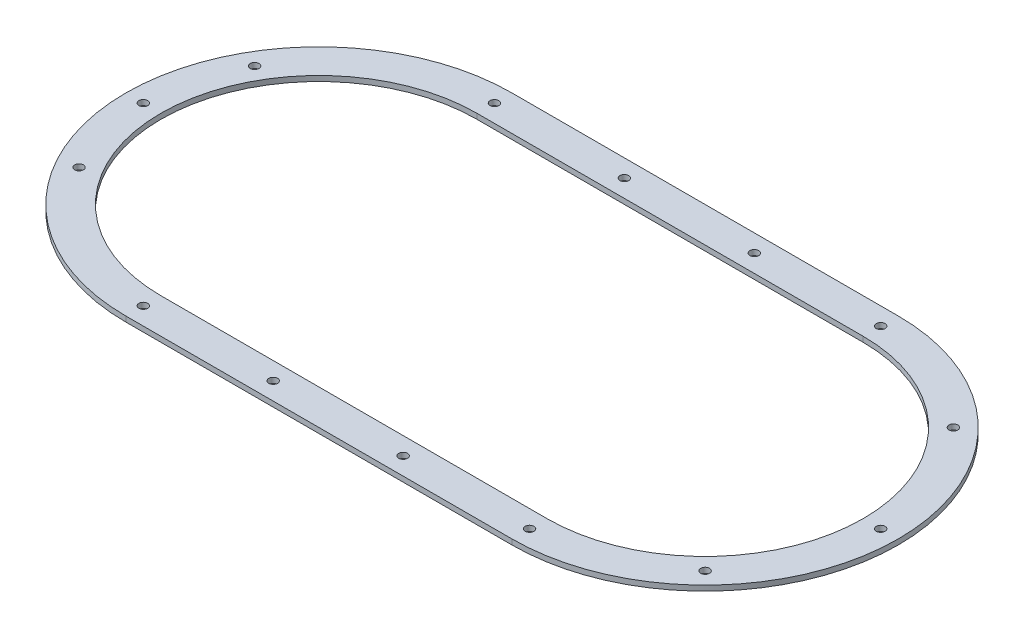
ISO-10303-21;
HEADER;
FILE_DESCRIPTION(('STEP AP214'),'2;1');
FILE_NAME('part.step','',(''),(''),'','','');
FILE_SCHEMA(('AUTOMOTIVE_DESIGN { 1 0 10303 214 1 1 1 1 }'));
ENDSEC;
DATA;
#1=APPLICATION_CONTEXT('core data for automotive mechanical design processes');
#2=APPLICATION_PROTOCOL_DEFINITION('international standard','automotive_design',2000,#1);
#3=PRODUCT_CONTEXT('',#1,'mechanical');
#4=PRODUCT('Part','Part','',(#3));
#5=PRODUCT_RELATED_PRODUCT_CATEGORY('part','',(#4));
#6=PRODUCT_DEFINITION_FORMATION('','',#4);
#7=PRODUCT_DEFINITION_CONTEXT('part definition',#1,'design');
#8=PRODUCT_DEFINITION('design','',#6,#7);
#9=PRODUCT_DEFINITION_SHAPE('','',#8);
#10=(LENGTH_UNIT() NAMED_UNIT(*) SI_UNIT(.MILLI.,.METRE.));
#11=(NAMED_UNIT(*) PLANE_ANGLE_UNIT() SI_UNIT($,.RADIAN.));
#12=(NAMED_UNIT(*) SI_UNIT($,.STERADIAN.) SOLID_ANGLE_UNIT());
#13=UNCERTAINTY_MEASURE_WITH_UNIT(LENGTH_MEASURE(1.E-05),#10,'distance_accuracy_value','');
#14=(GEOMETRIC_REPRESENTATION_CONTEXT(3) GLOBAL_UNCERTAINTY_ASSIGNED_CONTEXT((#13)) GLOBAL_UNIT_ASSIGNED_CONTEXT((#10,
#11,#12)) REPRESENTATION_CONTEXT('',''));
#15=CARTESIAN_POINT('',(0.,0.,0.));
#16=DIRECTION('',(0.,0.,1.));
#17=DIRECTION('',(1.,0.,0.));
#18=AXIS2_PLACEMENT_3D('',#15,#16,#17);
#19=CARTESIAN_POINT('',(288.544468479895,3.,-125.010465990964));
#20=DIRECTION('',(0.,-1.,0.));
#21=DIRECTION('',(0.,0.,-1.));
#22=AXIS2_PLACEMENT_3D('',#19,#20,#21);
#23=CYLINDRICAL_SURFACE('',#22,90.);
#24=CARTESIAN_POINT('',(288.544468479895,0.,-125.010465990964));
#25=DIRECTION('',(0.,1.,0.));
#26=DIRECTION('',(0.,0.,1.));
#27=AXIS2_PLACEMENT_3D('',#24,#25,#26);
#28=CIRCLE('',#27,90.);
#29=CARTESIAN_POINT('',(288.544468479896,0.,-35.0104659909643));
#30=VERTEX_POINT('',#29);
#31=CARTESIAN_POINT('',(288.544468479896,0.,-215.010465990964));
#32=VERTEX_POINT('',#31);
#33=EDGE_CURVE('E214',#30,#32,#28,.T.);
#34=ORIENTED_EDGE('',*,*,#33,.F.);
#35=DIRECTION('',(0.,-1.,0.));
#36=VECTOR('',#35,1.);
#37=CARTESIAN_POINT('',(288.544468479896,3.,-35.0104659909643));
#38=LINE('',#37,#36);
#39=CARTESIAN_POINT('',(288.544468479896,3.,-35.0104659909643));
#40=VERTEX_POINT('',#39);
#41=EDGE_CURVE('E11',#40,#30,#38,.T.);
#42=ORIENTED_EDGE('',*,*,#41,.F.);
#43=CARTESIAN_POINT('',(288.544468479895,3.,-125.010465990964));
#44=DIRECTION('',(0.,1.,0.));
#45=DIRECTION('',(0.,0.,1.));
#46=AXIS2_PLACEMENT_3D('',#43,#44,#45);
#47=CIRCLE('',#46,90.);
#48=CARTESIAN_POINT('',(288.544468479896,3.,-215.010465990964));
#49=VERTEX_POINT('',#48);
#50=EDGE_CURVE('E132',#40,#49,#47,.T.);
#51=ORIENTED_EDGE('',*,*,#50,.T.);
#52=DIRECTION('',(0.,-1.,0.));
#53=VECTOR('',#52,1.);
#54=CARTESIAN_POINT('',(288.544468479896,3.,-215.010465990964));
#55=LINE('',#54,#53);
#56=EDGE_CURVE('E95',#49,#32,#55,.T.);
#57=ORIENTED_EDGE('',*,*,#56,.T.);
#58=EDGE_LOOP('',(#34,#42,#51,#57));
#59=FACE_BOUND('',#58,.T.);
#60=ADVANCED_FACE('F41',(#59),#23,.F.);
#61=CARTESIAN_POINT('',(0.,3.,-35.0104659909643));
#62=DIRECTION('',(0.,0.,-1.));
#63=DIRECTION('',(-1.,0.,0.));
#64=AXIS2_PLACEMENT_3D('',#61,#62,#63);
#65=PLANE('',#64);
#66=DIRECTION('',(1.,0.,0.));
#67=VECTOR('',#66,1.);
#68=CARTESIAN_POINT('',(0.,0.,-35.0104659909643));
#69=LINE('',#68,#67);
#70=CARTESIAN_POINT('',(68.5444684798952,0.,-35.0104659909643));
#71=VERTEX_POINT('',#70);
#72=EDGE_CURVE('E123',#71,#30,#69,.T.);
#73=ORIENTED_EDGE('',*,*,#72,.F.);
#74=DIRECTION('',(0.,-1.,0.));
#75=VECTOR('',#74,1.);
#76=CARTESIAN_POINT('',(68.5444684798952,3.,-35.0104659909643));
#77=LINE('',#76,#75);
#78=CARTESIAN_POINT('',(68.5444684798952,3.,-35.0104659909643));
#79=VERTEX_POINT('',#78);
#80=EDGE_CURVE('E52',#79,#71,#77,.T.);
#81=ORIENTED_EDGE('',*,*,#80,.F.);
#82=DIRECTION('',(1.,0.,0.));
#83=VECTOR('',#82,1.);
#84=CARTESIAN_POINT('',(0.,3.,-35.0104659909643));
#85=LINE('',#84,#83);
#86=EDGE_CURVE('E121',#79,#40,#85,.T.);
#87=ORIENTED_EDGE('',*,*,#86,.T.);
#88=ORIENTED_EDGE('',*,*,#41,.T.);
#89=EDGE_LOOP('',(#73,#81,#87,#88));
#90=FACE_BOUND('',#89,.T.);
#91=ADVANCED_FACE('F120',(#90),#65,.T.);
#92=CARTESIAN_POINT('',(68.5444684798952,3.,-125.010465990964));
#93=DIRECTION('',(0.,-1.,0.));
#94=DIRECTION('',(0.,0.,-1.));
#95=AXIS2_PLACEMENT_3D('',#92,#93,#94);
#96=CYLINDRICAL_SURFACE('',#95,90.);
#97=CARTESIAN_POINT('',(68.5444684798952,0.,-125.010465990964));
#98=DIRECTION('',(0.,1.,0.));
#99=DIRECTION('',(0.,0.,1.));
#100=AXIS2_PLACEMENT_3D('',#97,#98,#99);
#101=CIRCLE('',#100,90.);
#102=CARTESIAN_POINT('',(68.5444684798952,0.,-215.010465990964));
#103=VERTEX_POINT('',#102);
#104=EDGE_CURVE('E220',#103,#71,#101,.T.);
#105=ORIENTED_EDGE('',*,*,#104,.F.);
#106=DIRECTION('',(0.,-1.,0.));
#107=VECTOR('',#106,1.);
#108=CARTESIAN_POINT('',(68.5444684798952,3.,-215.010465990964));
#109=LINE('',#108,#107);
#110=CARTESIAN_POINT('',(68.5444684798952,3.,-215.010465990964));
#111=VERTEX_POINT('',#110);
#112=EDGE_CURVE('E88',#111,#103,#109,.T.);
#113=ORIENTED_EDGE('',*,*,#112,.F.);
#114=CARTESIAN_POINT('',(68.5444684798952,3.,-125.010465990964));
#115=DIRECTION('',(0.,1.,0.));
#116=DIRECTION('',(0.,0.,1.));
#117=AXIS2_PLACEMENT_3D('',#114,#115,#116);
#118=CIRCLE('',#117,90.);
#119=EDGE_CURVE('E131',#111,#79,#118,.T.);
#120=ORIENTED_EDGE('',*,*,#119,.T.);
#121=ORIENTED_EDGE('',*,*,#80,.T.);
#122=EDGE_LOOP('',(#105,#113,#120,#121));
#123=FACE_BOUND('',#122,.T.);
#124=ADVANCED_FACE('F135',(#123),#96,.F.);
#125=CARTESIAN_POINT('',(0.,3.,-15.0104659909643));
#126=DIRECTION('',(0.,0.,-1.));
#127=DIRECTION('',(-1.,0.,0.));
#128=AXIS2_PLACEMENT_3D('',#125,#126,#127);
#129=PLANE('',#128);
#130=DIRECTION('',(1.,0.,0.));
#131=VECTOR('',#130,1.);
#132=CARTESIAN_POINT('',(0.,0.,-15.0104659909643));
#133=LINE('',#132,#131);
#134=CARTESIAN_POINT('',(68.5444684798952,0.,-15.0104659909643));
#135=VERTEX_POINT('',#134);
#136=CARTESIAN_POINT('',(288.544468479897,0.,-15.0104659909643));
#137=VERTEX_POINT('',#136);
#138=EDGE_CURVE('E199',#135,#137,#133,.T.);
#139=ORIENTED_EDGE('',*,*,#138,.T.);
#140=DIRECTION('',(0.,-1.,0.));
#141=VECTOR('',#140,1.);
#142=CARTESIAN_POINT('',(288.544468479897,3.,-15.0104659909643));
#143=LINE('',#142,#141);
#144=CARTESIAN_POINT('',(288.544468479897,3.,-15.0104659909643));
#145=VERTEX_POINT('',#144);
#146=EDGE_CURVE('E45',#145,#137,#143,.T.);
#147=ORIENTED_EDGE('',*,*,#146,.F.);
#148=DIRECTION('',(1.,0.,0.));
#149=VECTOR('',#148,1.);
#150=CARTESIAN_POINT('',(0.,3.,-15.0104659909643));
#151=LINE('',#150,#149);
#152=CARTESIAN_POINT('',(68.5444684798952,3.,-15.0104659909643));
#153=VERTEX_POINT('',#152);
#154=EDGE_CURVE('E266',#153,#145,#151,.T.);
#155=ORIENTED_EDGE('',*,*,#154,.F.);
#156=DIRECTION('',(0.,-1.,0.));
#157=VECTOR('',#156,1.);
#158=CARTESIAN_POINT('',(68.5444684798952,3.,-15.0104659909643));
#159=LINE('',#158,#157);
#160=EDGE_CURVE('E139',#153,#135,#159,.T.);
#161=ORIENTED_EDGE('',*,*,#160,.T.);
#162=EDGE_LOOP('',(#139,#147,#155,#161));
#163=FACE_BOUND('',#162,.T.);
#164=ADVANCED_FACE('F247',(#163),#129,.F.);
#165=CARTESIAN_POINT('',(288.544468479895,3.,-125.010465990964));
#166=DIRECTION('',(0.,-1.,0.));
#167=DIRECTION('',(0.,0.,-1.));
#168=AXIS2_PLACEMENT_3D('',#165,#166,#167);
#169=CYLINDRICAL_SURFACE('',#168,110.);
#170=CARTESIAN_POINT('',(288.544468479895,0.,-125.010465990964));
#171=DIRECTION('',(0.,1.,0.));
#172=DIRECTION('',(0.,0.,1.));
#173=AXIS2_PLACEMENT_3D('',#170,#171,#172);
#174=CIRCLE('',#173,110.);
#175=CARTESIAN_POINT('',(288.544468479896,0.,-235.010465990964));
#176=VERTEX_POINT('',#175);
#177=EDGE_CURVE('E203',#137,#176,#174,.T.);
#178=ORIENTED_EDGE('',*,*,#177,.T.);
#179=DIRECTION('',(0.,-1.,0.));
#180=VECTOR('',#179,1.);
#181=CARTESIAN_POINT('',(288.544468479896,3.,-235.010465990964));
#182=LINE('',#181,#180);
#183=CARTESIAN_POINT('',(288.544468479896,3.,-235.010465990964));
#184=VERTEX_POINT('',#183);
#185=EDGE_CURVE('E236',#184,#176,#182,.T.);
#186=ORIENTED_EDGE('',*,*,#185,.F.);
#187=CARTESIAN_POINT('',(288.544468479895,3.,-125.010465990964));
#188=DIRECTION('',(0.,1.,0.));
#189=DIRECTION('',(0.,0.,1.));
#190=AXIS2_PLACEMENT_3D('',#187,#188,#189);
#191=CIRCLE('',#190,110.);
#192=EDGE_CURVE('E103',#145,#184,#191,.T.);
#193=ORIENTED_EDGE('',*,*,#192,.F.);
#194=ORIENTED_EDGE('',*,*,#146,.T.);
#195=EDGE_LOOP('',(#178,#186,#193,#194));
#196=FACE_BOUND('',#195,.T.);
#197=ADVANCED_FACE('F243',(#196),#169,.T.);
#198=CARTESIAN_POINT('',(0.,3.,-235.010465990964));
#199=DIRECTION('',(0.,0.,-1.));
#200=DIRECTION('',(-1.,0.,0.));
#201=AXIS2_PLACEMENT_3D('',#198,#199,#200);
#202=PLANE('',#201);
#203=DIRECTION('',(1.,0.,0.));
#204=VECTOR('',#203,1.);
#205=CARTESIAN_POINT('',(0.,0.,-235.010465990964));
#206=LINE('',#205,#204);
#207=CARTESIAN_POINT('',(68.5444684798952,0.,-235.010465990964));
#208=VERTEX_POINT('',#207);
#209=EDGE_CURVE('E207',#208,#176,#206,.T.);
#210=ORIENTED_EDGE('',*,*,#209,.F.);
#211=DIRECTION('',(0.,-1.,0.));
#212=VECTOR('',#211,1.);
#213=CARTESIAN_POINT('',(68.5444684798952,3.,-235.010465990964));
#214=LINE('',#213,#212);
#215=CARTESIAN_POINT('',(68.5444684798952,3.,-235.010465990964));
#216=VERTEX_POINT('',#215);
#217=EDGE_CURVE('E234',#216,#208,#214,.T.);
#218=ORIENTED_EDGE('',*,*,#217,.F.);
#219=DIRECTION('',(1.,0.,0.));
#220=VECTOR('',#219,1.);
#221=CARTESIAN_POINT('',(0.,3.,-235.010465990964));
#222=LINE('',#221,#220);
#223=EDGE_CURVE('E256',#216,#184,#222,.T.);
#224=ORIENTED_EDGE('',*,*,#223,.T.);
#225=ORIENTED_EDGE('',*,*,#185,.T.);
#226=EDGE_LOOP('',(#210,#218,#224,#225));
#227=FACE_BOUND('',#226,.T.);
#228=ADVANCED_FACE('F253',(#227),#202,.T.);
#229=CARTESIAN_POINT('',(68.5444684798952,3.,-125.010465990964));
#230=DIRECTION('',(0.,-1.,0.));
#231=DIRECTION('',(0.,0.,-1.));
#232=AXIS2_PLACEMENT_3D('',#229,#230,#231);
#233=CYLINDRICAL_SURFACE('',#232,110.);
#234=CARTESIAN_POINT('',(68.5444684798952,0.,-125.010465990964));
#235=DIRECTION('',(0.,1.,0.));
#236=DIRECTION('',(0.,0.,1.));
#237=AXIS2_PLACEMENT_3D('',#234,#235,#236);
#238=CIRCLE('',#237,110.);
#239=EDGE_CURVE('E211',#208,#135,#238,.T.);
#240=ORIENTED_EDGE('',*,*,#239,.T.);
#241=ORIENTED_EDGE('',*,*,#160,.F.);
#242=CARTESIAN_POINT('',(68.5444684798952,3.,-125.010465990964));
#243=DIRECTION('',(0.,1.,0.));
#244=DIRECTION('',(0.,0.,1.));
#245=AXIS2_PLACEMENT_3D('',#242,#243,#244);
#246=CIRCLE('',#245,110.);
#247=EDGE_CURVE('E258',#216,#153,#246,.T.);
#248=ORIENTED_EDGE('',*,*,#247,.F.);
#249=ORIENTED_EDGE('',*,*,#217,.T.);
#250=EDGE_LOOP('',(#240,#241,#248,#249));
#251=FACE_BOUND('',#250,.T.);
#252=ADVANCED_FACE('F259',(#251),#233,.T.);
#253=CARTESIAN_POINT('',(68.5444684798952,3.,-225.010465990964));
#254=DIRECTION('',(0.,-1.,0.));
#255=DIRECTION('',(0.,0.,-1.));
#256=AXIS2_PLACEMENT_3D('',#253,#254,#255);
#257=CYLINDRICAL_SURFACE('',#256,2.5);
#258=CARTESIAN_POINT('',(68.5444684798952,3.,-225.010465990964));
#259=DIRECTION('',(0.,1.,0.));
#260=DIRECTION('',(0.,0.,1.));
#261=AXIS2_PLACEMENT_3D('',#258,#259,#260);
#262=CIRCLE('',#261,2.5);
#263=CARTESIAN_POINT('',(68.5444684798952,3.,-222.510465990964));
#264=VERTEX_POINT('',#263);
#265=EDGE_CURVE('E591',#264,#264,#262,.T.);
#266=ORIENTED_EDGE('',*,*,#265,.T.);
#267=EDGE_LOOP('',(#266));
#268=FACE_BOUND('',#267,.T.);
#269=CARTESIAN_POINT('',(68.5444684798952,0.,-225.010465990964));
#270=DIRECTION('',(0.,1.,0.));
#271=DIRECTION('',(0.,0.,1.));
#272=AXIS2_PLACEMENT_3D('',#269,#270,#271);
#273=CIRCLE('',#272,2.5);
#274=CARTESIAN_POINT('',(68.5444684798952,0.,-222.510465990964));
#275=VERTEX_POINT('',#274);
#276=EDGE_CURVE('E195',#275,#275,#273,.T.);
#277=ORIENTED_EDGE('',*,*,#276,.F.);
#278=EDGE_LOOP('',(#277));
#279=FACE_BOUND('',#278,.T.);
#280=ADVANCED_FACE('F292',(#268,#279),#257,.F.);
#281=CARTESIAN_POINT('',(142.544468479895,3.,-225.010465990964));
#282=DIRECTION('',(0.,-1.,0.));
#283=DIRECTION('',(0.,0.,-1.));
#284=AXIS2_PLACEMENT_3D('',#281,#282,#283);
#285=CYLINDRICAL_SURFACE('',#284,2.5);
#286=CARTESIAN_POINT('',(142.544468479895,3.,-225.010465990964));
#287=DIRECTION('',(0.,1.,0.));
#288=DIRECTION('',(0.,0.,1.));
#289=AXIS2_PLACEMENT_3D('',#286,#287,#288);
#290=CIRCLE('',#289,2.5);
#291=CARTESIAN_POINT('',(142.544468479895,3.,-222.510465990964));
#292=VERTEX_POINT('',#291);
#293=EDGE_CURVE('E587',#292,#292,#290,.T.);
#294=ORIENTED_EDGE('',*,*,#293,.T.);
#295=EDGE_LOOP('',(#294));
#296=FACE_BOUND('',#295,.T.);
#297=CARTESIAN_POINT('',(142.544468479895,0.,-225.010465990964));
#298=DIRECTION('',(0.,1.,0.));
#299=DIRECTION('',(0.,0.,1.));
#300=AXIS2_PLACEMENT_3D('',#297,#298,#299);
#301=CIRCLE('',#300,2.5);
#302=CARTESIAN_POINT('',(142.544468479895,0.,-222.510465990964));
#303=VERTEX_POINT('',#302);
#304=EDGE_CURVE('E191',#303,#303,#301,.T.);
#305=ORIENTED_EDGE('',*,*,#304,.F.);
#306=EDGE_LOOP('',(#305));
#307=FACE_BOUND('',#306,.T.);
#308=ADVANCED_FACE('F301',(#296,#307),#285,.F.);
#309=CARTESIAN_POINT('',(-18.0580718985487,3.,-175.010465990964));
#310=DIRECTION('',(0.,-1.,0.));
#311=DIRECTION('',(0.,0.,-1.));
#312=AXIS2_PLACEMENT_3D('',#309,#310,#311);
#313=CYLINDRICAL_SURFACE('',#312,2.5);
#314=CARTESIAN_POINT('',(-18.0580718985487,3.,-175.010465990964));
#315=DIRECTION('',(0.,1.,0.));
#316=DIRECTION('',(0.,0.,1.));
#317=AXIS2_PLACEMENT_3D('',#314,#315,#316);
#318=CIRCLE('',#317,2.5);
#319=CARTESIAN_POINT('',(-18.0580718985487,3.,-172.510465990964));
#320=VERTEX_POINT('',#319);
#321=EDGE_CURVE('E583',#320,#320,#318,.T.);
#322=ORIENTED_EDGE('',*,*,#321,.T.);
#323=EDGE_LOOP('',(#322));
#324=FACE_BOUND('',#323,.T.);
#325=CARTESIAN_POINT('',(-18.0580718985487,0.,-175.010465990964));
#326=DIRECTION('',(0.,1.,0.));
#327=DIRECTION('',(0.,0.,1.));
#328=AXIS2_PLACEMENT_3D('',#325,#326,#327);
#329=CIRCLE('',#328,2.5);
#330=CARTESIAN_POINT('',(-18.0580718985487,0.,-172.510465990964));
#331=VERTEX_POINT('',#330);
#332=EDGE_CURVE('E187',#331,#331,#329,.T.);
#333=ORIENTED_EDGE('',*,*,#332,.F.);
#334=EDGE_LOOP('',(#333));
#335=FACE_BOUND('',#334,.T.);
#336=ADVANCED_FACE('F305',(#324,#335),#313,.F.);
#337=CARTESIAN_POINT('',(-31.4555315201048,3.,-125.010465990964));
#338=DIRECTION('',(0.,-1.,0.));
#339=DIRECTION('',(0.,0.,-1.));
#340=AXIS2_PLACEMENT_3D('',#337,#338,#339);
#341=CYLINDRICAL_SURFACE('',#340,2.5);
#342=CARTESIAN_POINT('',(-31.4555315201048,3.,-125.010465990964));
#343=DIRECTION('',(0.,1.,0.));
#344=DIRECTION('',(0.,0.,1.));
#345=AXIS2_PLACEMENT_3D('',#342,#343,#344);
#346=CIRCLE('',#345,2.5);
#347=CARTESIAN_POINT('',(-31.4555315201048,3.,-122.510465990964));
#348=VERTEX_POINT('',#347);
#349=EDGE_CURVE('E579',#348,#348,#346,.T.);
#350=ORIENTED_EDGE('',*,*,#349,.T.);
#351=EDGE_LOOP('',(#350));
#352=FACE_BOUND('',#351,.T.);
#353=CARTESIAN_POINT('',(-31.4555315201048,0.,-125.010465990964));
#354=DIRECTION('',(0.,1.,0.));
#355=DIRECTION('',(0.,0.,1.));
#356=AXIS2_PLACEMENT_3D('',#353,#354,#355);
#357=CIRCLE('',#356,2.5);
#358=CARTESIAN_POINT('',(-31.4555315201048,0.,-122.510465990964));
#359=VERTEX_POINT('',#358);
#360=EDGE_CURVE('E183',#359,#359,#357,.T.);
#361=ORIENTED_EDGE('',*,*,#360,.F.);
#362=EDGE_LOOP('',(#361));
#363=FACE_BOUND('',#362,.T.);
#364=ADVANCED_FACE('F309',(#352,#363),#341,.F.);
#365=CARTESIAN_POINT('',(-18.0580718985486,3.,-75.0104659909641));
#366=DIRECTION('',(0.,-1.,0.));
#367=DIRECTION('',(0.,0.,-1.));
#368=AXIS2_PLACEMENT_3D('',#365,#366,#367);
#369=CYLINDRICAL_SURFACE('',#368,2.5);
#370=CARTESIAN_POINT('',(-18.0580718985486,3.,-75.0104659909641));
#371=DIRECTION('',(0.,1.,0.));
#372=DIRECTION('',(0.,0.,1.));
#373=AXIS2_PLACEMENT_3D('',#370,#371,#372);
#374=CIRCLE('',#373,2.5);
#375=CARTESIAN_POINT('',(-18.0580718985486,3.,-72.5104659909641));
#376=VERTEX_POINT('',#375);
#377=EDGE_CURVE('E575',#376,#376,#374,.T.);
#378=ORIENTED_EDGE('',*,*,#377,.T.);
#379=EDGE_LOOP('',(#378));
#380=FACE_BOUND('',#379,.T.);
#381=CARTESIAN_POINT('',(-18.0580718985486,0.,-75.0104659909641));
#382=DIRECTION('',(0.,1.,0.));
#383=DIRECTION('',(0.,0.,1.));
#384=AXIS2_PLACEMENT_3D('',#381,#382,#383);
#385=CIRCLE('',#384,2.5);
#386=CARTESIAN_POINT('',(-18.0580718985486,0.,-72.5104659909641));
#387=VERTEX_POINT('',#386);
#388=EDGE_CURVE('E179',#387,#387,#385,.T.);
#389=ORIENTED_EDGE('',*,*,#388,.F.);
#390=EDGE_LOOP('',(#389));
#391=FACE_BOUND('',#390,.T.);
#392=ADVANCED_FACE('F313',(#380,#391),#369,.F.);
#393=CARTESIAN_POINT('',(68.5444684798952,3.,-25.0104659909643));
#394=DIRECTION('',(0.,-1.,0.));
#395=DIRECTION('',(0.,0.,-1.));
#396=AXIS2_PLACEMENT_3D('',#393,#394,#395);
#397=CYLINDRICAL_SURFACE('',#396,2.5);
#398=CARTESIAN_POINT('',(68.5444684798952,3.,-25.0104659909643));
#399=DIRECTION('',(0.,1.,0.));
#400=DIRECTION('',(0.,0.,1.));
#401=AXIS2_PLACEMENT_3D('',#398,#399,#400);
#402=CIRCLE('',#401,2.5);
#403=CARTESIAN_POINT('',(68.5444684798952,3.,-22.5104659909643));
#404=VERTEX_POINT('',#403);
#405=EDGE_CURVE('E571',#404,#404,#402,.T.);
#406=ORIENTED_EDGE('',*,*,#405,.T.);
#407=EDGE_LOOP('',(#406));
#408=FACE_BOUND('',#407,.T.);
#409=CARTESIAN_POINT('',(68.5444684798952,0.,-25.0104659909643));
#410=DIRECTION('',(0.,1.,0.));
#411=DIRECTION('',(0.,0.,1.));
#412=AXIS2_PLACEMENT_3D('',#409,#410,#411);
#413=CIRCLE('',#412,2.5);
#414=CARTESIAN_POINT('',(68.5444684798952,0.,-22.5104659909643));
#415=VERTEX_POINT('',#414);
#416=EDGE_CURVE('E175',#415,#415,#413,.T.);
#417=ORIENTED_EDGE('',*,*,#416,.F.);
#418=EDGE_LOOP('',(#417));
#419=FACE_BOUND('',#418,.T.);
#420=ADVANCED_FACE('F317',(#408,#419),#397,.F.);
#421=CARTESIAN_POINT('',(142.544468479895,3.,-25.0104659909643));
#422=DIRECTION('',(0.,-1.,0.));
#423=DIRECTION('',(0.,0.,-1.));
#424=AXIS2_PLACEMENT_3D('',#421,#422,#423);
#425=CYLINDRICAL_SURFACE('',#424,2.5);
#426=CARTESIAN_POINT('',(142.544468479895,3.,-25.0104659909643));
#427=DIRECTION('',(0.,1.,0.));
#428=DIRECTION('',(0.,0.,1.));
#429=AXIS2_PLACEMENT_3D('',#426,#427,#428);
#430=CIRCLE('',#429,2.5);
#431=CARTESIAN_POINT('',(142.544468479895,3.,-22.5104659909643));
#432=VERTEX_POINT('',#431);
#433=EDGE_CURVE('E567',#432,#432,#430,.T.);
#434=ORIENTED_EDGE('',*,*,#433,.T.);
#435=EDGE_LOOP('',(#434));
#436=FACE_BOUND('',#435,.T.);
#437=CARTESIAN_POINT('',(142.544468479895,0.,-25.0104659909643));
#438=DIRECTION('',(0.,1.,0.));
#439=DIRECTION('',(0.,0.,1.));
#440=AXIS2_PLACEMENT_3D('',#437,#438,#439);
#441=CIRCLE('',#440,2.5);
#442=CARTESIAN_POINT('',(142.544468479895,0.,-22.5104659909643));
#443=VERTEX_POINT('',#442);
#444=EDGE_CURVE('E171',#443,#443,#441,.T.);
#445=ORIENTED_EDGE('',*,*,#444,.F.);
#446=EDGE_LOOP('',(#445));
#447=FACE_BOUND('',#446,.T.);
#448=ADVANCED_FACE('F321',(#436,#447),#425,.F.);
#449=CARTESIAN_POINT('',(216.544468479895,3.,-25.0104659909643));
#450=DIRECTION('',(0.,-1.,0.));
#451=DIRECTION('',(0.,0.,-1.));
#452=AXIS2_PLACEMENT_3D('',#449,#450,#451);
#453=CYLINDRICAL_SURFACE('',#452,2.5);
#454=CARTESIAN_POINT('',(216.544468479895,3.,-25.0104659909643));
#455=DIRECTION('',(0.,1.,0.));
#456=DIRECTION('',(0.,0.,1.));
#457=AXIS2_PLACEMENT_3D('',#454,#455,#456);
#458=CIRCLE('',#457,2.5);
#459=CARTESIAN_POINT('',(216.544468479895,3.,-22.5104659909643));
#460=VERTEX_POINT('',#459);
#461=EDGE_CURVE('E563',#460,#460,#458,.T.);
#462=ORIENTED_EDGE('',*,*,#461,.T.);
#463=EDGE_LOOP('',(#462));
#464=FACE_BOUND('',#463,.T.);
#465=CARTESIAN_POINT('',(216.544468479895,0.,-25.0104659909643));
#466=DIRECTION('',(0.,1.,0.));
#467=DIRECTION('',(0.,0.,1.));
#468=AXIS2_PLACEMENT_3D('',#465,#466,#467);
#469=CIRCLE('',#468,2.5);
#470=CARTESIAN_POINT('',(216.544468479895,0.,-22.5104659909643));
#471=VERTEX_POINT('',#470);
#472=EDGE_CURVE('E167',#471,#471,#469,.T.);
#473=ORIENTED_EDGE('',*,*,#472,.F.);
#474=EDGE_LOOP('',(#473));
#475=FACE_BOUND('',#474,.T.);
#476=ADVANCED_FACE('F325',(#464,#475),#453,.F.);
#477=CARTESIAN_POINT('',(288.544468479897,3.,-25.0104659909643));
#478=DIRECTION('',(0.,-1.,0.));
#479=DIRECTION('',(0.,0.,-1.));
#480=AXIS2_PLACEMENT_3D('',#477,#478,#479);
#481=CYLINDRICAL_SURFACE('',#480,2.49999999999996);
#482=CARTESIAN_POINT('',(288.544468479897,3.,-25.0104659909643));
#483=DIRECTION('',(0.,1.,0.));
#484=DIRECTION('',(0.,0.,1.));
#485=AXIS2_PLACEMENT_3D('',#482,#483,#484);
#486=CIRCLE('',#485,2.49999999999996);
#487=CARTESIAN_POINT('',(288.544468479897,3.,-22.5104659909644));
#488=VERTEX_POINT('',#487);
#489=EDGE_CURVE('E559',#488,#488,#486,.T.);
#490=ORIENTED_EDGE('',*,*,#489,.T.);
#491=EDGE_LOOP('',(#490));
#492=FACE_BOUND('',#491,.T.);
#493=CARTESIAN_POINT('',(288.544468479897,0.,-25.0104659909643));
#494=DIRECTION('',(0.,1.,0.));
#495=DIRECTION('',(0.,0.,1.));
#496=AXIS2_PLACEMENT_3D('',#493,#494,#495);
#497=CIRCLE('',#496,2.49999999999996);
#498=CARTESIAN_POINT('',(288.544468479897,0.,-22.5104659909644));
#499=VERTEX_POINT('',#498);
#500=EDGE_CURVE('E163',#499,#499,#497,.T.);
#501=ORIENTED_EDGE('',*,*,#500,.F.);
#502=EDGE_LOOP('',(#501));
#503=FACE_BOUND('',#502,.T.);
#504=ADVANCED_FACE('F329',(#492,#503),#481,.F.);
#505=CARTESIAN_POINT('',(359.25514659855,3.,-54.2997878723095));
#506=DIRECTION('',(0.,-1.,0.));
#507=DIRECTION('',(0.,0.,-1.));
#508=AXIS2_PLACEMENT_3D('',#505,#506,#507);
#509=CYLINDRICAL_SURFACE('',#508,2.50000000000002);
#510=CARTESIAN_POINT('',(359.25514659855,3.,-54.2997878723095));
#511=DIRECTION('',(0.,1.,0.));
#512=DIRECTION('',(0.,0.,1.));
#513=AXIS2_PLACEMENT_3D('',#510,#511,#512);
#514=CIRCLE('',#513,2.50000000000002);
#515=CARTESIAN_POINT('',(359.25514659855,3.,-51.7997878723095));
#516=VERTEX_POINT('',#515);
#517=EDGE_CURVE('E555',#516,#516,#514,.T.);
#518=ORIENTED_EDGE('',*,*,#517,.T.);
#519=EDGE_LOOP('',(#518));
#520=FACE_BOUND('',#519,.T.);
#521=CARTESIAN_POINT('',(359.25514659855,0.,-54.2997878723095));
#522=DIRECTION('',(0.,1.,0.));
#523=DIRECTION('',(0.,0.,1.));
#524=AXIS2_PLACEMENT_3D('',#521,#522,#523);
#525=CIRCLE('',#524,2.50000000000002);
#526=CARTESIAN_POINT('',(359.25514659855,0.,-51.7997878723095));
#527=VERTEX_POINT('',#526);
#528=EDGE_CURVE('E159',#527,#527,#525,.T.);
#529=ORIENTED_EDGE('',*,*,#528,.F.);
#530=EDGE_LOOP('',(#529));
#531=FACE_BOUND('',#530,.T.);
#532=ADVANCED_FACE('F333',(#520,#531),#509,.F.);
#533=CARTESIAN_POINT('',(388.544468479895,3.,-125.010465990964));
#534=DIRECTION('',(0.,-1.,0.));
#535=DIRECTION('',(0.,0.,-1.));
#536=AXIS2_PLACEMENT_3D('',#533,#534,#535);
#537=CYLINDRICAL_SURFACE('',#536,2.50000000000059);
#538=CARTESIAN_POINT('',(388.544468479895,3.,-125.010465990964));
#539=DIRECTION('',(0.,1.,0.));
#540=DIRECTION('',(0.,0.,1.));
#541=AXIS2_PLACEMENT_3D('',#538,#539,#540);
#542=CIRCLE('',#541,2.50000000000059);
#543=CARTESIAN_POINT('',(388.544468479895,3.,-122.510465990964));
#544=VERTEX_POINT('',#543);
#545=EDGE_CURVE('E547',#544,#544,#542,.T.);
#546=ORIENTED_EDGE('',*,*,#545,.T.);
#547=EDGE_LOOP('',(#546));
#548=FACE_BOUND('',#547,.T.);
#549=CARTESIAN_POINT('',(388.544468479895,0.,-125.010465990964));
#550=DIRECTION('',(0.,1.,0.));
#551=DIRECTION('',(0.,0.,1.));
#552=AXIS2_PLACEMENT_3D('',#549,#550,#551);
#553=CIRCLE('',#552,2.50000000000059);
#554=CARTESIAN_POINT('',(388.544468479895,0.,-122.510465990964));
#555=VERTEX_POINT('',#554);
#556=EDGE_CURVE('E155',#555,#555,#553,.T.);
#557=ORIENTED_EDGE('',*,*,#556,.F.);
#558=EDGE_LOOP('',(#557));
#559=FACE_BOUND('',#558,.T.);
#560=ADVANCED_FACE('F337',(#548,#559),#537,.F.);
#561=CARTESIAN_POINT('',(359.25514659855,3.,-195.721144109619));
#562=DIRECTION('',(0.,-1.,0.));
#563=DIRECTION('',(0.,0.,-1.));
#564=AXIS2_PLACEMENT_3D('',#561,#562,#563);
#565=CYLINDRICAL_SURFACE('',#564,2.50000000000002);
#566=CARTESIAN_POINT('',(359.25514659855,3.,-195.721144109619));
#567=DIRECTION('',(0.,1.,0.));
#568=DIRECTION('',(0.,0.,1.));
#569=AXIS2_PLACEMENT_3D('',#566,#567,#568);
#570=CIRCLE('',#569,2.50000000000002);
#571=CARTESIAN_POINT('',(359.25514659855,3.,-193.221144109619));
#572=VERTEX_POINT('',#571);
#573=EDGE_CURVE('E542',#572,#572,#570,.T.);
#574=ORIENTED_EDGE('',*,*,#573,.T.);
#575=EDGE_LOOP('',(#574));
#576=FACE_BOUND('',#575,.T.);
#577=CARTESIAN_POINT('',(359.25514659855,0.,-195.721144109619));
#578=DIRECTION('',(0.,1.,0.));
#579=DIRECTION('',(0.,0.,1.));
#580=AXIS2_PLACEMENT_3D('',#577,#578,#579);
#581=CIRCLE('',#580,2.50000000000002);
#582=CARTESIAN_POINT('',(359.25514659855,0.,-193.221144109619));
#583=VERTEX_POINT('',#582);
#584=EDGE_CURVE('E151',#583,#583,#581,.T.);
#585=ORIENTED_EDGE('',*,*,#584,.F.);
#586=EDGE_LOOP('',(#585));
#587=FACE_BOUND('',#586,.T.);
#588=ADVANCED_FACE('F341',(#576,#587),#565,.F.);
#589=CARTESIAN_POINT('',(216.544468479895,3.,-225.010465990964));
#590=DIRECTION('',(0.,-1.,0.));
#591=DIRECTION('',(0.,0.,-1.));
#592=AXIS2_PLACEMENT_3D('',#589,#590,#591);
#593=CYLINDRICAL_SURFACE('',#592,2.5);
#594=CARTESIAN_POINT('',(216.544468479895,3.,-225.010465990964));
#595=DIRECTION('',(0.,1.,0.));
#596=DIRECTION('',(0.,0.,1.));
#597=AXIS2_PLACEMENT_3D('',#594,#595,#596);
#598=CIRCLE('',#597,2.5);
#599=CARTESIAN_POINT('',(216.544468479895,3.,-222.510465990964));
#600=VERTEX_POINT('',#599);
#601=EDGE_CURVE('E352',#600,#600,#598,.T.);
#602=ORIENTED_EDGE('',*,*,#601,.T.);
#603=EDGE_LOOP('',(#602));
#604=FACE_BOUND('',#603,.T.);
#605=CARTESIAN_POINT('',(216.544468479895,0.,-225.010465990964));
#606=DIRECTION('',(0.,1.,0.));
#607=DIRECTION('',(0.,0.,1.));
#608=AXIS2_PLACEMENT_3D('',#605,#606,#607);
#609=CIRCLE('',#608,2.5);
#610=CARTESIAN_POINT('',(216.544468479895,0.,-222.510465990964));
#611=VERTEX_POINT('',#610);
#612=EDGE_CURVE('E147',#611,#611,#609,.T.);
#613=ORIENTED_EDGE('',*,*,#612,.F.);
#614=EDGE_LOOP('',(#613));
#615=FACE_BOUND('',#614,.T.);
#616=ADVANCED_FACE('F279',(#604,#615),#593,.F.);
#617=CARTESIAN_POINT('',(288.544468479895,3.,-225.010465990964));
#618=DIRECTION('',(0.,-1.,0.));
#619=DIRECTION('',(0.,0.,-1.));
#620=AXIS2_PLACEMENT_3D('',#617,#618,#619);
#621=CYLINDRICAL_SURFACE('',#620,2.49999999999996);
#622=CARTESIAN_POINT('',(288.544468479895,3.,-225.010465990964));
#623=DIRECTION('',(0.,1.,0.));
#624=DIRECTION('',(0.,0.,1.));
#625=AXIS2_PLACEMENT_3D('',#622,#623,#624);
#626=CIRCLE('',#625,2.49999999999996);
#627=CARTESIAN_POINT('',(288.544468479895,3.,-222.510465990964));
#628=VERTEX_POINT('',#627);
#629=EDGE_CURVE('E226',#628,#628,#626,.T.);
#630=ORIENTED_EDGE('',*,*,#629,.T.);
#631=EDGE_LOOP('',(#630));
#632=FACE_BOUND('',#631,.T.);
#633=CARTESIAN_POINT('',(288.544468479895,0.,-225.010465990964));
#634=DIRECTION('',(0.,1.,0.));
#635=DIRECTION('',(0.,0.,1.));
#636=AXIS2_PLACEMENT_3D('',#633,#634,#635);
#637=CIRCLE('',#636,2.49999999999996);
#638=CARTESIAN_POINT('',(288.544468479895,0.,-222.510465990964));
#639=VERTEX_POINT('',#638);
#640=EDGE_CURVE('E143',#639,#639,#637,.T.);
#641=ORIENTED_EDGE('',*,*,#640,.F.);
#642=EDGE_LOOP('',(#641));
#643=FACE_BOUND('',#642,.T.);
#644=ADVANCED_FACE('F43',(#632,#643),#621,.F.);
#645=CARTESIAN_POINT('',(0.,3.,-215.010465990964));
#646=DIRECTION('',(0.,0.,-1.));
#647=DIRECTION('',(-1.,0.,0.));
#648=AXIS2_PLACEMENT_3D('',#645,#646,#647);
#649=PLANE('',#648);
#650=DIRECTION('',(1.,0.,0.));
#651=VECTOR('',#650,1.);
#652=CARTESIAN_POINT('',(0.,0.,-215.010465990964));
#653=LINE('',#652,#651);
#654=EDGE_CURVE('E223',#103,#32,#653,.T.);
#655=ORIENTED_EDGE('',*,*,#654,.T.);
#656=ORIENTED_EDGE('',*,*,#56,.F.);
#657=DIRECTION('',(1.,0.,0.));
#658=VECTOR('',#657,1.);
#659=CARTESIAN_POINT('',(0.,3.,-215.010465990964));
#660=LINE('',#659,#658);
#661=EDGE_CURVE('E61',#111,#49,#660,.T.);
#662=ORIENTED_EDGE('',*,*,#661,.F.);
#663=ORIENTED_EDGE('',*,*,#112,.T.);
#664=EDGE_LOOP('',(#655,#656,#662,#663));
#665=FACE_BOUND('',#664,.T.);
#666=ADVANCED_FACE('F270',(#665),#649,.F.);
#667=CARTESIAN_POINT('',(0.,3.,0.));
#668=DIRECTION('',(0.,1.,0.));
#669=DIRECTION('',(0.,0.,1.));
#670=AXIS2_PLACEMENT_3D('',#667,#668,#669);
#671=PLANE('',#670);
#672=ORIENTED_EDGE('',*,*,#629,.F.);
#673=EDGE_LOOP('',(#672));
#674=FACE_BOUND('',#673,.T.);
#675=ORIENTED_EDGE('',*,*,#601,.F.);
#676=EDGE_LOOP('',(#675));
#677=FACE_BOUND('',#676,.T.);
#678=ORIENTED_EDGE('',*,*,#573,.F.);
#679=EDGE_LOOP('',(#678));
#680=FACE_BOUND('',#679,.T.);
#681=ORIENTED_EDGE('',*,*,#545,.F.);
#682=EDGE_LOOP('',(#681));
#683=FACE_BOUND('',#682,.T.);
#684=ORIENTED_EDGE('',*,*,#517,.F.);
#685=EDGE_LOOP('',(#684));
#686=FACE_BOUND('',#685,.T.);
#687=ORIENTED_EDGE('',*,*,#489,.F.);
#688=EDGE_LOOP('',(#687));
#689=FACE_BOUND('',#688,.T.);
#690=ORIENTED_EDGE('',*,*,#461,.F.);
#691=EDGE_LOOP('',(#690));
#692=FACE_BOUND('',#691,.T.);
#693=ORIENTED_EDGE('',*,*,#433,.F.);
#694=EDGE_LOOP('',(#693));
#695=FACE_BOUND('',#694,.T.);
#696=ORIENTED_EDGE('',*,*,#405,.F.);
#697=EDGE_LOOP('',(#696));
#698=FACE_BOUND('',#697,.T.);
#699=ORIENTED_EDGE('',*,*,#377,.F.);
#700=EDGE_LOOP('',(#699));
#701=FACE_BOUND('',#700,.T.);
#702=ORIENTED_EDGE('',*,*,#349,.F.);
#703=EDGE_LOOP('',(#702));
#704=FACE_BOUND('',#703,.T.);
#705=ORIENTED_EDGE('',*,*,#321,.F.);
#706=EDGE_LOOP('',(#705));
#707=FACE_BOUND('',#706,.T.);
#708=ORIENTED_EDGE('',*,*,#293,.F.);
#709=EDGE_LOOP('',(#708));
#710=FACE_BOUND('',#709,.T.);
#711=ORIENTED_EDGE('',*,*,#265,.F.);
#712=EDGE_LOOP('',(#711));
#713=FACE_BOUND('',#712,.T.);
#714=ORIENTED_EDGE('',*,*,#154,.T.);
#715=ORIENTED_EDGE('',*,*,#192,.T.);
#716=ORIENTED_EDGE('',*,*,#223,.F.);
#717=ORIENTED_EDGE('',*,*,#247,.T.);
#718=EDGE_LOOP('',(#714,#715,#716,#717));
#719=FACE_BOUND('',#718,.T.);
#720=ORIENTED_EDGE('',*,*,#50,.F.);
#721=ORIENTED_EDGE('',*,*,#86,.F.);
#722=ORIENTED_EDGE('',*,*,#119,.F.);
#723=ORIENTED_EDGE('',*,*,#661,.T.);
#724=EDGE_LOOP('',(#720,#721,#722,#723));
#725=FACE_BOUND('',#724,.T.);
#726=ADVANCED_FACE('F130',(#674,#677,#680,#683,#686,#689,#692,#695,#698,#701,#704,#707,#710,
#713,#719,#725),#671,.T.);
#727=CARTESIAN_POINT('',(0.,0.,0.));
#728=DIRECTION('',(0.,1.,0.));
#729=DIRECTION('',(0.,0.,1.));
#730=AXIS2_PLACEMENT_3D('',#727,#728,#729);
#731=PLANE('',#730);
#732=ORIENTED_EDGE('',*,*,#640,.T.);
#733=EDGE_LOOP('',(#732));
#734=FACE_BOUND('',#733,.T.);
#735=ORIENTED_EDGE('',*,*,#612,.T.);
#736=EDGE_LOOP('',(#735));
#737=FACE_BOUND('',#736,.T.);
#738=ORIENTED_EDGE('',*,*,#584,.T.);
#739=EDGE_LOOP('',(#738));
#740=FACE_BOUND('',#739,.T.);
#741=ORIENTED_EDGE('',*,*,#556,.T.);
#742=EDGE_LOOP('',(#741));
#743=FACE_BOUND('',#742,.T.);
#744=ORIENTED_EDGE('',*,*,#528,.T.);
#745=EDGE_LOOP('',(#744));
#746=FACE_BOUND('',#745,.T.);
#747=ORIENTED_EDGE('',*,*,#500,.T.);
#748=EDGE_LOOP('',(#747));
#749=FACE_BOUND('',#748,.T.);
#750=ORIENTED_EDGE('',*,*,#472,.T.);
#751=EDGE_LOOP('',(#750));
#752=FACE_BOUND('',#751,.T.);
#753=ORIENTED_EDGE('',*,*,#444,.T.);
#754=EDGE_LOOP('',(#753));
#755=FACE_BOUND('',#754,.T.);
#756=ORIENTED_EDGE('',*,*,#416,.T.);
#757=EDGE_LOOP('',(#756));
#758=FACE_BOUND('',#757,.T.);
#759=ORIENTED_EDGE('',*,*,#388,.T.);
#760=EDGE_LOOP('',(#759));
#761=FACE_BOUND('',#760,.T.);
#762=ORIENTED_EDGE('',*,*,#360,.T.);
#763=EDGE_LOOP('',(#762));
#764=FACE_BOUND('',#763,.T.);
#765=ORIENTED_EDGE('',*,*,#332,.T.);
#766=EDGE_LOOP('',(#765));
#767=FACE_BOUND('',#766,.T.);
#768=ORIENTED_EDGE('',*,*,#304,.T.);
#769=EDGE_LOOP('',(#768));
#770=FACE_BOUND('',#769,.T.);
#771=ORIENTED_EDGE('',*,*,#276,.T.);
#772=EDGE_LOOP('',(#771));
#773=FACE_BOUND('',#772,.T.);
#774=ORIENTED_EDGE('',*,*,#138,.F.);
#775=ORIENTED_EDGE('',*,*,#239,.F.);
#776=ORIENTED_EDGE('',*,*,#209,.T.);
#777=ORIENTED_EDGE('',*,*,#177,.F.);
#778=EDGE_LOOP('',(#774,#775,#776,#777));
#779=FACE_BOUND('',#778,.T.);
#780=ORIENTED_EDGE('',*,*,#33,.T.);
#781=ORIENTED_EDGE('',*,*,#654,.F.);
#782=ORIENTED_EDGE('',*,*,#104,.T.);
#783=ORIENTED_EDGE('',*,*,#72,.T.);
#784=EDGE_LOOP('',(#780,#781,#782,#783));
#785=FACE_BOUND('',#784,.T.);
#786=ADVANCED_FACE('F251',(#734,#737,#740,#743,#746,#749,#752,#755,#758,#761,#764,#767,#770,
#773,#779,#785),#731,.F.);
#787=CLOSED_SHELL('',(#60,#91,#124,#164,#197,#228,#252,#280,#308,#336,#364,#392,#420,#448,#476,
#504,#532,#560,#588,#616,#644,#666,#726,#786));
#788=MANIFOLD_SOLID_BREP('B2',#787);
#789=ADVANCED_BREP_SHAPE_REPRESENTATION('',(#18,#788),#14);
#790=SHAPE_DEFINITION_REPRESENTATION(#9,#789);
ENDSEC;
END-ISO-10303-21;
